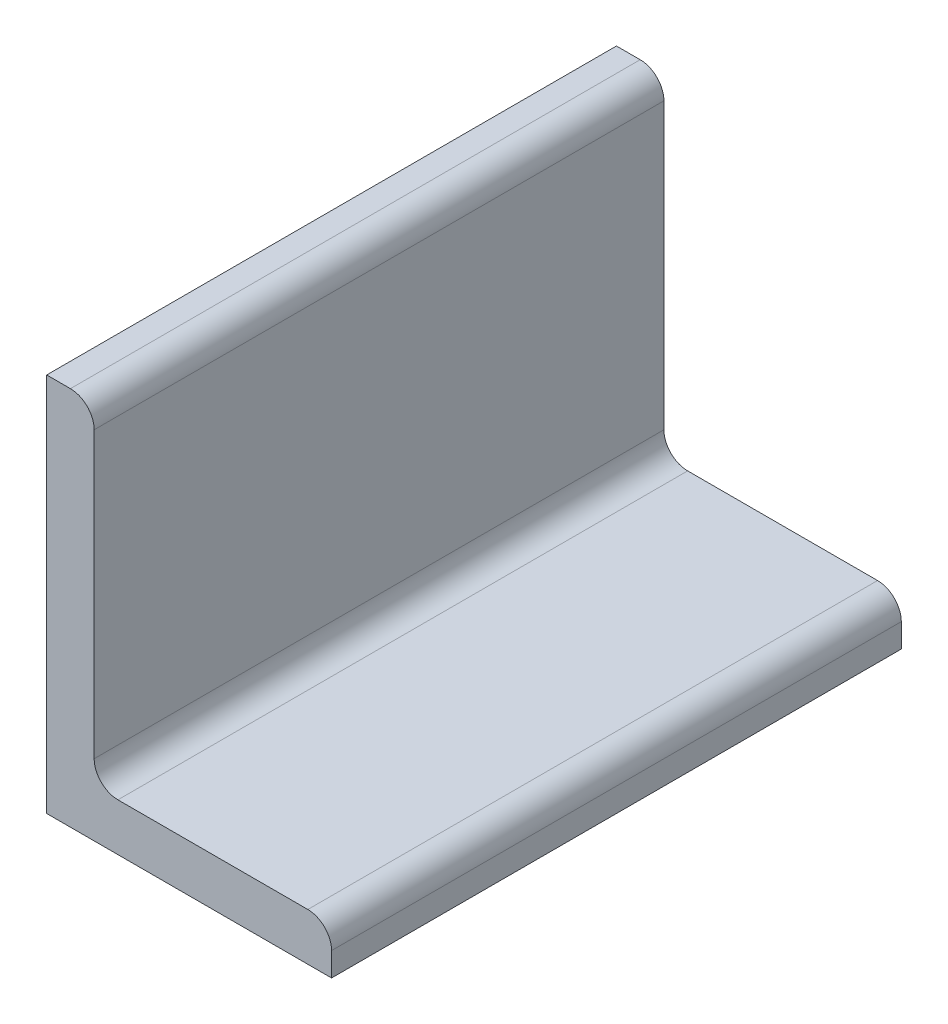
ISO-10303-21;
HEADER;
FILE_DESCRIPTION(('STEP AP214'),'2;1');
FILE_NAME('part.step','',(''),(''),'','','');
FILE_SCHEMA(('AUTOMOTIVE_DESIGN { 1 0 10303 214 1 1 1 1 }'));
ENDSEC;
DATA;
#1=APPLICATION_CONTEXT('core data for automotive mechanical design processes');
#2=APPLICATION_PROTOCOL_DEFINITION('international standard','automotive_design',2000,#1);
#3=PRODUCT_CONTEXT('',#1,'mechanical');
#4=PRODUCT('Part','Part','',(#3));
#5=PRODUCT_RELATED_PRODUCT_CATEGORY('part','',(#4));
#6=PRODUCT_DEFINITION_FORMATION('','',#4);
#7=PRODUCT_DEFINITION_CONTEXT('part definition',#1,'design');
#8=PRODUCT_DEFINITION('design','',#6,#7);
#9=PRODUCT_DEFINITION_SHAPE('','',#8);
#10=(LENGTH_UNIT() NAMED_UNIT(*) SI_UNIT(.MILLI.,.METRE.));
#11=(NAMED_UNIT(*) PLANE_ANGLE_UNIT() SI_UNIT($,.RADIAN.));
#12=(NAMED_UNIT(*) SI_UNIT($,.STERADIAN.) SOLID_ANGLE_UNIT());
#13=UNCERTAINTY_MEASURE_WITH_UNIT(LENGTH_MEASURE(1.E-05),#10,'distance_accuracy_value','');
#14=(GEOMETRIC_REPRESENTATION_CONTEXT(3) GLOBAL_UNCERTAINTY_ASSIGNED_CONTEXT((#13)) GLOBAL_UNIT_ASSIGNED_CONTEXT((#10,
#11,#12)) REPRESENTATION_CONTEXT('',''));
#15=CARTESIAN_POINT('',(0.,0.,0.));
#16=DIRECTION('',(0.,0.,1.));
#17=DIRECTION('',(1.,0.,0.));
#18=AXIS2_PLACEMENT_3D('',#15,#16,#17);
#19=CARTESIAN_POINT('',(0.425014111727251,203.678837479771,304.8));
#20=DIRECTION('',(1.,0.,0.));
#21=DIRECTION('',(0.,0.,-1.));
#22=AXIS2_PLACEMENT_3D('',#19,#20,#21);
#23=PLANE('',#22);
#24=DIRECTION('',(0.,-1.,0.));
#25=VECTOR('',#24,1.);
#26=CARTESIAN_POINT('',(0.425014111727251,203.678837479771,0.));
#27=LINE('',#26,#25);
#28=CARTESIAN_POINT('',(0.425014111727251,203.678837479771,0.));
#29=VERTEX_POINT('',#28);
#30=CARTESIAN_POINT('',(0.425014111727251,0.478837479771347,0.));
#31=VERTEX_POINT('',#30);
#32=EDGE_CURVE('E135',#29,#31,#27,.T.);
#33=ORIENTED_EDGE('',*,*,#32,.T.);
#34=DIRECTION('',(0.,0.,-1.));
#35=VECTOR('',#34,1.);
#36=CARTESIAN_POINT('',(0.425014111727251,0.478837479771347,304.8));
#37=LINE('',#36,#35);
#38=CARTESIAN_POINT('',(0.425014111727251,0.478837479771347,304.8));
#39=VERTEX_POINT('',#38);
#40=EDGE_CURVE('E11',#39,#31,#37,.T.);
#41=ORIENTED_EDGE('',*,*,#40,.F.);
#42=DIRECTION('',(0.,-1.,0.));
#43=VECTOR('',#42,1.);
#44=CARTESIAN_POINT('',(0.425014111727251,203.678837479771,304.8));
#45=LINE('',#44,#43);
#46=CARTESIAN_POINT('',(0.425014111727251,203.678837479771,304.8));
#47=VERTEX_POINT('',#46);
#48=EDGE_CURVE('E151',#47,#39,#45,.T.);
#49=ORIENTED_EDGE('',*,*,#48,.F.);
#50=DIRECTION('',(0.,0.,-1.));
#51=VECTOR('',#50,1.);
#52=CARTESIAN_POINT('',(0.425014111727251,203.678837479771,304.8));
#53=LINE('',#52,#51);
#54=EDGE_CURVE('E131',#47,#29,#53,.T.);
#55=ORIENTED_EDGE('',*,*,#54,.T.);
#56=EDGE_LOOP('',(#33,#41,#49,#55));
#57=FACE_BOUND('',#56,.T.);
#58=ADVANCED_FACE('F33',(#57),#23,.F.);
#59=CARTESIAN_POINT('',(0.425014111727251,0.478837479771347,304.8));
#60=DIRECTION('',(0.,1.,0.));
#61=DIRECTION('',(0.,0.,1.));
#62=AXIS2_PLACEMENT_3D('',#59,#60,#61);
#63=PLANE('',#62);
#64=DIRECTION('',(1.,0.,0.));
#65=VECTOR('',#64,1.);
#66=CARTESIAN_POINT('',(0.425014111727251,0.478837479771347,0.));
#67=LINE('',#66,#65);
#68=CARTESIAN_POINT('',(152.825014111727,0.478837479771347,0.));
#69=VERTEX_POINT('',#68);
#70=EDGE_CURVE('E138',#31,#69,#67,.T.);
#71=ORIENTED_EDGE('',*,*,#70,.T.);
#72=DIRECTION('',(0.,0.,-1.));
#73=VECTOR('',#72,1.);
#74=CARTESIAN_POINT('',(152.825014111727,0.478837479771347,304.8));
#75=LINE('',#74,#73);
#76=CARTESIAN_POINT('',(152.825014111727,0.478837479771347,304.8));
#77=VERTEX_POINT('',#76);
#78=EDGE_CURVE('E41',#77,#69,#75,.T.);
#79=ORIENTED_EDGE('',*,*,#78,.F.);
#80=DIRECTION('',(1.,0.,0.));
#81=VECTOR('',#80,1.);
#82=CARTESIAN_POINT('',(0.425014111727251,0.478837479771347,304.8));
#83=LINE('',#82,#81);
#84=EDGE_CURVE('E95',#39,#77,#83,.T.);
#85=ORIENTED_EDGE('',*,*,#84,.F.);
#86=ORIENTED_EDGE('',*,*,#40,.T.);
#87=EDGE_LOOP('',(#71,#79,#85,#86));
#88=FACE_BOUND('',#87,.T.);
#89=ADVANCED_FACE('F194',(#88),#63,.F.);
#90=CARTESIAN_POINT('',(152.825014111727,0.478837479771347,304.8));
#91=DIRECTION('',(-1.,0.,0.));
#92=DIRECTION('',(0.,0.,1.));
#93=AXIS2_PLACEMENT_3D('',#90,#91,#92);
#94=PLANE('',#93);
#95=DIRECTION('',(0.,1.,0.));
#96=VECTOR('',#95,1.);
#97=CARTESIAN_POINT('',(152.825014111727,0.478837479771347,0.));
#98=LINE('',#97,#96);
#99=CARTESIAN_POINT('',(152.825014111727,13.1788374797713,0.));
#100=VERTEX_POINT('',#99);
#101=EDGE_CURVE('E140',#69,#100,#98,.T.);
#102=ORIENTED_EDGE('',*,*,#101,.T.);
#103=DIRECTION('',(0.,0.,-1.));
#104=VECTOR('',#103,1.);
#105=CARTESIAN_POINT('',(152.825014111727,13.1788374797713,304.8));
#106=LINE('',#105,#104);
#107=CARTESIAN_POINT('',(152.825014111727,13.1788374797713,304.8));
#108=VERTEX_POINT('',#107);
#109=EDGE_CURVE('E161',#108,#100,#106,.T.);
#110=ORIENTED_EDGE('',*,*,#109,.F.);
#111=DIRECTION('',(0.,1.,0.));
#112=VECTOR('',#111,1.);
#113=CARTESIAN_POINT('',(152.825014111727,0.478837479771347,304.8));
#114=LINE('',#113,#112);
#115=EDGE_CURVE('E169',#77,#108,#114,.T.);
#116=ORIENTED_EDGE('',*,*,#115,.F.);
#117=ORIENTED_EDGE('',*,*,#78,.T.);
#118=EDGE_LOOP('',(#102,#110,#116,#117));
#119=FACE_BOUND('',#118,.T.);
#120=ADVANCED_FACE('F167',(#119),#94,.F.);
#121=CARTESIAN_POINT('',(140.125014111727,13.1788374797713,304.8));
#122=DIRECTION('',(0.,0.,-1.));
#123=DIRECTION('',(-1.,0.,0.));
#124=AXIS2_PLACEMENT_3D('',#121,#122,#123);
#125=CYLINDRICAL_SURFACE('',#124,12.7);
#126=CARTESIAN_POINT('',(140.125014111727,13.1788374797713,0.));
#127=DIRECTION('',(0.,0.,1.));
#128=DIRECTION('',(1.,0.,0.));
#129=AXIS2_PLACEMENT_3D('',#126,#127,#128);
#130=CIRCLE('',#129,12.7);
#131=CARTESIAN_POINT('',(140.125014111727,25.8788374797713,0.));
#132=VERTEX_POINT('',#131);
#133=EDGE_CURVE('E142',#100,#132,#130,.T.);
#134=ORIENTED_EDGE('',*,*,#133,.T.);
#135=DIRECTION('',(0.,0.,-1.));
#136=VECTOR('',#135,1.);
#137=CARTESIAN_POINT('',(140.125014111727,25.8788374797713,304.8));
#138=LINE('',#137,#136);
#139=CARTESIAN_POINT('',(140.125014111727,25.8788374797713,304.8));
#140=VERTEX_POINT('',#139);
#141=EDGE_CURVE('E158',#140,#132,#138,.T.);
#142=ORIENTED_EDGE('',*,*,#141,.F.);
#143=CARTESIAN_POINT('',(140.125014111727,13.1788374797713,304.8));
#144=DIRECTION('',(0.,0.,1.));
#145=DIRECTION('',(1.,0.,0.));
#146=AXIS2_PLACEMENT_3D('',#143,#144,#145);
#147=CIRCLE('',#146,12.7);
#148=EDGE_CURVE('E185',#108,#140,#147,.T.);
#149=ORIENTED_EDGE('',*,*,#148,.F.);
#150=ORIENTED_EDGE('',*,*,#109,.T.);
#151=EDGE_LOOP('',(#134,#142,#149,#150));
#152=FACE_BOUND('',#151,.T.);
#153=ADVANCED_FACE('F178',(#152),#125,.T.);
#154=CARTESIAN_POINT('',(140.125014111727,25.8788374797713,304.8));
#155=DIRECTION('',(0.,-1.,0.));
#156=DIRECTION('',(1.,0.,0.));
#157=AXIS2_PLACEMENT_3D('',#154,#155,#156);
#158=PLANE('',#157);
#159=DIRECTION('',(-1.,0.,0.));
#160=VECTOR('',#159,1.);
#161=CARTESIAN_POINT('',(140.125014111727,25.8788374797713,0.));
#162=LINE('',#161,#160);
#163=CARTESIAN_POINT('',(38.5250141117273,25.8788374797714,0.));
#164=VERTEX_POINT('',#163);
#165=EDGE_CURVE('E144',#132,#164,#162,.T.);
#166=ORIENTED_EDGE('',*,*,#165,.T.);
#167=DIRECTION('',(0.,0.,-1.));
#168=VECTOR('',#167,1.);
#169=CARTESIAN_POINT('',(38.5250141117273,25.8788374797714,304.8));
#170=LINE('',#169,#168);
#171=CARTESIAN_POINT('',(38.5250141117273,25.8788374797714,304.8));
#172=VERTEX_POINT('',#171);
#173=EDGE_CURVE('E155',#172,#164,#170,.T.);
#174=ORIENTED_EDGE('',*,*,#173,.F.);
#175=DIRECTION('',(-1.,0.,0.));
#176=VECTOR('',#175,1.);
#177=CARTESIAN_POINT('',(140.125014111727,25.8788374797713,304.8));
#178=LINE('',#177,#176);
#179=EDGE_CURVE('E184',#140,#172,#178,.T.);
#180=ORIENTED_EDGE('',*,*,#179,.F.);
#181=ORIENTED_EDGE('',*,*,#141,.T.);
#182=EDGE_LOOP('',(#166,#174,#180,#181));
#183=FACE_BOUND('',#182,.T.);
#184=ADVANCED_FACE('F182',(#183),#158,.F.);
#185=CARTESIAN_POINT('',(38.5250141117272,38.5788374797714,304.8));
#186=DIRECTION('',(0.,0.,-1.));
#187=DIRECTION('',(-1.,0.,0.));
#188=AXIS2_PLACEMENT_3D('',#185,#186,#187);
#189=CYLINDRICAL_SURFACE('',#188,12.7);
#190=CARTESIAN_POINT('',(38.5250141117272,38.5788374797714,0.));
#191=DIRECTION('',(0.,0.,-1.));
#192=DIRECTION('',(1.,0.,0.));
#193=AXIS2_PLACEMENT_3D('',#190,#191,#192);
#194=CIRCLE('',#193,12.7);
#195=CARTESIAN_POINT('',(25.8250141117272,38.5788374797714,0.));
#196=VERTEX_POINT('',#195);
#197=EDGE_CURVE('E146',#164,#196,#194,.T.);
#198=ORIENTED_EDGE('',*,*,#197,.T.);
#199=DIRECTION('',(0.,0.,-1.));
#200=VECTOR('',#199,1.);
#201=CARTESIAN_POINT('',(25.8250141117272,38.5788374797714,304.8));
#202=LINE('',#201,#200);
#203=CARTESIAN_POINT('',(25.8250141117272,38.5788374797714,304.8));
#204=VERTEX_POINT('',#203);
#205=EDGE_CURVE('E126',#204,#196,#202,.T.);
#206=ORIENTED_EDGE('',*,*,#205,.F.);
#207=CARTESIAN_POINT('',(38.5250141117272,38.5788374797714,304.8));
#208=DIRECTION('',(0.,0.,-1.));
#209=DIRECTION('',(1.,0.,0.));
#210=AXIS2_PLACEMENT_3D('',#207,#208,#209);
#211=CIRCLE('',#210,12.7);
#212=EDGE_CURVE('E117',#172,#204,#211,.T.);
#213=ORIENTED_EDGE('',*,*,#212,.F.);
#214=ORIENTED_EDGE('',*,*,#173,.T.);
#215=EDGE_LOOP('',(#198,#206,#213,#214));
#216=FACE_BOUND('',#215,.T.);
#217=ADVANCED_FACE('F206',(#216),#189,.F.);
#218=CARTESIAN_POINT('',(25.8250141117272,38.5788374797714,304.8));
#219=DIRECTION('',(-1.,0.,0.));
#220=DIRECTION('',(0.,0.,1.));
#221=AXIS2_PLACEMENT_3D('',#218,#219,#220);
#222=PLANE('',#221);
#223=DIRECTION('',(0.,1.,0.));
#224=VECTOR('',#223,1.);
#225=CARTESIAN_POINT('',(25.8250141117272,38.5788374797714,0.));
#226=LINE('',#225,#224);
#227=CARTESIAN_POINT('',(25.8250141117272,190.978837479771,0.));
#228=VERTEX_POINT('',#227);
#229=EDGE_CURVE('E125',#196,#228,#226,.T.);
#230=ORIENTED_EDGE('',*,*,#229,.T.);
#231=DIRECTION('',(0.,0.,-1.));
#232=VECTOR('',#231,1.);
#233=CARTESIAN_POINT('',(25.8250141117272,190.978837479771,304.8));
#234=LINE('',#233,#232);
#235=CARTESIAN_POINT('',(25.8250141117272,190.978837479771,304.8));
#236=VERTEX_POINT('',#235);
#237=EDGE_CURVE('E122',#236,#228,#234,.T.);
#238=ORIENTED_EDGE('',*,*,#237,.F.);
#239=DIRECTION('',(0.,1.,0.));
#240=VECTOR('',#239,1.);
#241=CARTESIAN_POINT('',(25.8250141117272,38.5788374797714,304.8));
#242=LINE('',#241,#240);
#243=EDGE_CURVE('E111',#204,#236,#242,.T.);
#244=ORIENTED_EDGE('',*,*,#243,.F.);
#245=ORIENTED_EDGE('',*,*,#205,.T.);
#246=EDGE_LOOP('',(#230,#238,#244,#245));
#247=FACE_BOUND('',#246,.T.);
#248=ADVANCED_FACE('F123',(#247),#222,.F.);
#249=CARTESIAN_POINT('',(13.1250141117272,190.978837479771,304.8));
#250=DIRECTION('',(0.,0.,-1.));
#251=DIRECTION('',(-1.,0.,0.));
#252=AXIS2_PLACEMENT_3D('',#249,#250,#251);
#253=CYLINDRICAL_SURFACE('',#252,12.7);
#254=CARTESIAN_POINT('',(13.1250141117272,190.978837479771,0.));
#255=DIRECTION('',(0.,0.,1.));
#256=DIRECTION('',(1.,0.,0.));
#257=AXIS2_PLACEMENT_3D('',#254,#255,#256);
#258=CIRCLE('',#257,12.7);
#259=CARTESIAN_POINT('',(13.1250141117273,203.678837479771,0.));
#260=VERTEX_POINT('',#259);
#261=EDGE_CURVE('E81',#228,#260,#258,.T.);
#262=ORIENTED_EDGE('',*,*,#261,.T.);
#263=DIRECTION('',(0.,0.,-1.));
#264=VECTOR('',#263,1.);
#265=CARTESIAN_POINT('',(13.1250141117273,203.678837479771,304.8));
#266=LINE('',#265,#264);
#267=CARTESIAN_POINT('',(13.1250141117273,203.678837479771,304.8));
#268=VERTEX_POINT('',#267);
#269=EDGE_CURVE('E127',#268,#260,#266,.T.);
#270=ORIENTED_EDGE('',*,*,#269,.F.);
#271=CARTESIAN_POINT('',(13.1250141117272,190.978837479771,304.8));
#272=DIRECTION('',(0.,0.,1.));
#273=DIRECTION('',(1.,0.,0.));
#274=AXIS2_PLACEMENT_3D('',#271,#272,#273);
#275=CIRCLE('',#274,12.7);
#276=EDGE_CURVE('E115',#236,#268,#275,.T.);
#277=ORIENTED_EDGE('',*,*,#276,.F.);
#278=ORIENTED_EDGE('',*,*,#237,.T.);
#279=EDGE_LOOP('',(#262,#270,#277,#278));
#280=FACE_BOUND('',#279,.T.);
#281=ADVANCED_FACE('F129',(#280),#253,.T.);
#282=CARTESIAN_POINT('',(13.1250141117273,203.678837479771,304.8));
#283=DIRECTION('',(0.,-1.,0.));
#284=DIRECTION('',(0.,0.,-1.));
#285=AXIS2_PLACEMENT_3D('',#282,#283,#284);
#286=PLANE('',#285);
#287=DIRECTION('',(-1.,0.,0.));
#288=VECTOR('',#287,1.);
#289=CARTESIAN_POINT('',(13.1250141117273,203.678837479771,0.));
#290=LINE('',#289,#288);
#291=EDGE_CURVE('E87',#260,#29,#290,.T.);
#292=ORIENTED_EDGE('',*,*,#291,.T.);
#293=ORIENTED_EDGE('',*,*,#54,.F.);
#294=DIRECTION('',(-1.,0.,0.));
#295=VECTOR('',#294,1.);
#296=CARTESIAN_POINT('',(13.1250141117273,203.678837479771,304.8));
#297=LINE('',#296,#295);
#298=EDGE_CURVE('E49',#268,#47,#297,.T.);
#299=ORIENTED_EDGE('',*,*,#298,.F.);
#300=ORIENTED_EDGE('',*,*,#269,.T.);
#301=EDGE_LOOP('',(#292,#293,#299,#300));
#302=FACE_BOUND('',#301,.T.);
#303=ADVANCED_FACE('F214',(#302),#286,.F.);
#304=CARTESIAN_POINT('',(140.125014111727,13.1788374797713,304.8));
#305=DIRECTION('',(0.,0.,1.));
#306=DIRECTION('',(1.,0.,0.));
#307=AXIS2_PLACEMENT_3D('',#304,#305,#306);
#308=PLANE('',#307);
#309=ORIENTED_EDGE('',*,*,#48,.T.);
#310=ORIENTED_EDGE('',*,*,#84,.T.);
#311=ORIENTED_EDGE('',*,*,#115,.T.);
#312=ORIENTED_EDGE('',*,*,#148,.T.);
#313=ORIENTED_EDGE('',*,*,#179,.T.);
#314=ORIENTED_EDGE('',*,*,#212,.T.);
#315=ORIENTED_EDGE('',*,*,#243,.T.);
#316=ORIENTED_EDGE('',*,*,#276,.T.);
#317=ORIENTED_EDGE('',*,*,#298,.T.);
#318=EDGE_LOOP('',(#309,#310,#311,#312,#313,#314,#315,#316,#317));
#319=FACE_BOUND('',#318,.T.);
#320=ADVANCED_FACE('F113',(#319),#308,.T.);
#321=CARTESIAN_POINT('',(140.125014111727,13.1788374797713,0.));
#322=DIRECTION('',(0.,0.,1.));
#323=DIRECTION('',(1.,0.,0.));
#324=AXIS2_PLACEMENT_3D('',#321,#322,#323);
#325=PLANE('',#324);
#326=ORIENTED_EDGE('',*,*,#32,.F.);
#327=ORIENTED_EDGE('',*,*,#291,.F.);
#328=ORIENTED_EDGE('',*,*,#261,.F.);
#329=ORIENTED_EDGE('',*,*,#229,.F.);
#330=ORIENTED_EDGE('',*,*,#197,.F.);
#331=ORIENTED_EDGE('',*,*,#165,.F.);
#332=ORIENTED_EDGE('',*,*,#133,.F.);
#333=ORIENTED_EDGE('',*,*,#101,.F.);
#334=ORIENTED_EDGE('',*,*,#70,.F.);
#335=EDGE_LOOP('',(#326,#327,#328,#329,#330,#331,#332,#333,#334));
#336=FACE_BOUND('',#335,.T.);
#337=ADVANCED_FACE('F173',(#336),#325,.F.);
#338=CLOSED_SHELL('',(#58,#89,#120,#153,#184,#217,#248,#281,#303,#320,#337));
#339=MANIFOLD_SOLID_BREP('B2',#338);
#340=ADVANCED_BREP_SHAPE_REPRESENTATION('',(#18,#339),#14);
#341=SHAPE_DEFINITION_REPRESENTATION(#9,#340);
ENDSEC;
END-ISO-10303-21;
